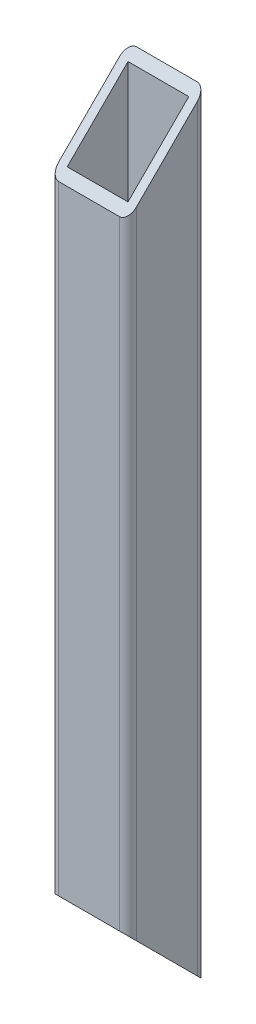
ISO-10303-21;
HEADER;
FILE_DESCRIPTION(('STEP AP214'),'2;1');
FILE_NAME('part.step','',(''),(''),'','','');
FILE_SCHEMA(('AUTOMOTIVE_DESIGN { 1 0 10303 214 1 1 1 1 }'));
ENDSEC;
DATA;
#1=APPLICATION_CONTEXT('core data for automotive mechanical design processes');
#2=APPLICATION_PROTOCOL_DEFINITION('international standard','automotive_design',2000,#1);
#3=PRODUCT_CONTEXT('',#1,'mechanical');
#4=PRODUCT('Part','Part','',(#3));
#5=PRODUCT_RELATED_PRODUCT_CATEGORY('part','',(#4));
#6=PRODUCT_DEFINITION_FORMATION('','',#4);
#7=PRODUCT_DEFINITION_CONTEXT('part definition',#1,'design');
#8=PRODUCT_DEFINITION('design','',#6,#7);
#9=PRODUCT_DEFINITION_SHAPE('','',#8);
#10=(LENGTH_UNIT() NAMED_UNIT(*) SI_UNIT(.MILLI.,.METRE.));
#11=(NAMED_UNIT(*) PLANE_ANGLE_UNIT() SI_UNIT($,.RADIAN.));
#12=(NAMED_UNIT(*) SI_UNIT($,.STERADIAN.) SOLID_ANGLE_UNIT());
#13=UNCERTAINTY_MEASURE_WITH_UNIT(LENGTH_MEASURE(1.E-05),#10,'distance_accuracy_value','');
#14=(GEOMETRIC_REPRESENTATION_CONTEXT(3) GLOBAL_UNCERTAINTY_ASSIGNED_CONTEXT((#13)) GLOBAL_UNIT_ASSIGNED_CONTEXT((#10,
#11,#12)) REPRESENTATION_CONTEXT('',''));
#15=CARTESIAN_POINT('',(0.,0.,0.));
#16=DIRECTION('',(0.,0.,1.));
#17=DIRECTION('',(1.,0.,0.));
#18=AXIS2_PLACEMENT_3D('',#15,#16,#17);
#19=CARTESIAN_POINT('',(22.8,254.788,2.8));
#20=DIRECTION('',(0.,-1.,0.));
#21=DIRECTION('',(0.,0.,-1.));
#22=AXIS2_PLACEMENT_3D('',#19,#20,#21);
#23=CYLINDRICAL_SURFACE('',#22,2.8);
#24=CARTESIAN_POINT('',(22.8,251.988,2.8));
#25=DIRECTION('',(0.,0.707106781186556,0.707106781186539));
#26=DIRECTION('',(0.,-0.707106781186539,0.707106781186556));
#27=AXIS2_PLACEMENT_3D('',#24,#25,#26);
#28=ELLIPSE('',#27,3.95979797464462,2.8);
#29=CARTESIAN_POINT('',(25.6,251.988,2.80000000000002));
#30=VERTEX_POINT('',#29);
#31=CARTESIAN_POINT('',(22.8,254.788,0.));
#32=VERTEX_POINT('',#31);
#33=EDGE_CURVE('E143',#30,#32,#28,.T.);
#34=ORIENTED_EDGE('',*,*,#33,.F.);
#35=DIRECTION('',(0.,-1.,0.));
#36=VECTOR('',#35,1.);
#37=CARTESIAN_POINT('',(25.6,254.788,2.80000000000002));
#38=LINE('',#37,#36);
#39=CARTESIAN_POINT('',(25.6,2.80000000000002,2.80000000000002));
#40=VERTEX_POINT('',#39);
#41=EDGE_CURVE('E144',#30,#40,#38,.T.);
#42=ORIENTED_EDGE('',*,*,#41,.T.);
#43=CARTESIAN_POINT('',(22.8,2.79999999999997,2.8));
#44=DIRECTION('',(0.,0.707106781186546,-0.707106781186549));
#45=DIRECTION('',(0.,-0.707106781186549,-0.707106781186546));
#46=AXIS2_PLACEMENT_3D('',#43,#44,#45);
#47=ELLIPSE('',#46,3.95979797464467,2.8);
#48=CARTESIAN_POINT('',(22.7999999999999,0.,0.));
#49=VERTEX_POINT('',#48);
#50=EDGE_CURVE('E205',#40,#49,#47,.T.);
#51=ORIENTED_EDGE('',*,*,#50,.T.);
#52=DIRECTION('',(0.,-1.,0.));
#53=VECTOR('',#52,1.);
#54=CARTESIAN_POINT('',(22.8,254.788,0.));
#55=LINE('',#54,#53);
#56=EDGE_CURVE('E131',#32,#49,#55,.T.);
#57=ORIENTED_EDGE('',*,*,#56,.F.);
#58=EDGE_LOOP('',(#34,#42,#51,#57));
#59=FACE_BOUND('',#58,.T.);
#60=ADVANCED_FACE('F32',(#59),#23,.T.);
#61=CARTESIAN_POINT('',(2.8,254.788,2.8));
#62=DIRECTION('',(0.,-1.,0.));
#63=DIRECTION('',(0.,0.,-1.));
#64=AXIS2_PLACEMENT_3D('',#61,#62,#63);
#65=CYLINDRICAL_SURFACE('',#64,2.8);
#66=CARTESIAN_POINT('',(2.8,251.988,2.8));
#67=DIRECTION('',(0.,0.707106781186556,0.707106781186539));
#68=DIRECTION('',(0.,-0.707106781186539,0.707106781186556));
#69=AXIS2_PLACEMENT_3D('',#66,#67,#68);
#70=ELLIPSE('',#69,3.95979797464462,2.8);
#71=CARTESIAN_POINT('',(2.80000000000002,254.788,0.));
#72=VERTEX_POINT('',#71);
#73=CARTESIAN_POINT('',(0.,251.988,2.80000000000002));
#74=VERTEX_POINT('',#73);
#75=EDGE_CURVE('E135',#72,#74,#70,.T.);
#76=ORIENTED_EDGE('',*,*,#75,.F.);
#77=DIRECTION('',(0.,-1.,0.));
#78=VECTOR('',#77,1.);
#79=CARTESIAN_POINT('',(2.80000000000002,254.788,0.));
#80=LINE('',#79,#78);
#81=CARTESIAN_POINT('',(2.80000000000002,0.,0.));
#82=VERTEX_POINT('',#81);
#83=EDGE_CURVE('E121',#72,#82,#80,.T.);
#84=ORIENTED_EDGE('',*,*,#83,.T.);
#85=CARTESIAN_POINT('',(2.8,2.80000000000002,2.8));
#86=DIRECTION('',(0.,0.707106781186546,-0.707106781186549));
#87=DIRECTION('',(0.,-0.707106781186549,-0.707106781186546));
#88=AXIS2_PLACEMENT_3D('',#85,#86,#87);
#89=ELLIPSE('',#88,3.95979797464467,2.8);
#90=CARTESIAN_POINT('',(0.,2.80000000000005,2.80000000000002));
#91=VERTEX_POINT('',#90);
#92=EDGE_CURVE('E203',#82,#91,#89,.T.);
#93=ORIENTED_EDGE('',*,*,#92,.T.);
#94=DIRECTION('',(0.,-1.,0.));
#95=VECTOR('',#94,1.);
#96=CARTESIAN_POINT('',(0.,254.788,2.80000000000002));
#97=LINE('',#96,#95);
#98=EDGE_CURVE('E132',#74,#91,#97,.T.);
#99=ORIENTED_EDGE('',*,*,#98,.F.);
#100=EDGE_LOOP('',(#76,#84,#93,#99));
#101=FACE_BOUND('',#100,.T.);
#102=ADVANCED_FACE('F136',(#101),#65,.T.);
#103=CARTESIAN_POINT('',(0.,254.788,2.80000000000002));
#104=DIRECTION('',(1.,0.,0.));
#105=DIRECTION('',(0.,0.,-1.));
#106=AXIS2_PLACEMENT_3D('',#103,#104,#105);
#107=PLANE('',#106);
#108=DIRECTION('',(0.,-0.707106781186539,0.707106781186556));
#109=VECTOR('',#108,1.);
#110=CARTESIAN_POINT('',(0.,253.388,1.40000000000004));
#111=LINE('',#110,#109);
#112=CARTESIAN_POINT('',(0.,231.988000000001,22.8));
#113=VERTEX_POINT('',#112);
#114=EDGE_CURVE('E46',#74,#113,#111,.T.);
#115=ORIENTED_EDGE('',*,*,#114,.F.);
#116=ORIENTED_EDGE('',*,*,#98,.T.);
#117=DIRECTION('',(0.,0.707106781186549,0.707106781186546));
#118=VECTOR('',#117,1.);
#119=CARTESIAN_POINT('',(0.,128.794,128.794));
#120=LINE('',#119,#118);
#121=CARTESIAN_POINT('',(0.,22.8,22.8));
#122=VERTEX_POINT('',#121);
#123=EDGE_CURVE('E200',#91,#122,#120,.T.);
#124=ORIENTED_EDGE('',*,*,#123,.T.);
#125=DIRECTION('',(0.,-1.,0.));
#126=VECTOR('',#125,1.);
#127=CARTESIAN_POINT('',(0.,254.788,22.8));
#128=LINE('',#127,#126);
#129=EDGE_CURVE('E159',#113,#122,#128,.T.);
#130=ORIENTED_EDGE('',*,*,#129,.F.);
#131=EDGE_LOOP('',(#115,#116,#124,#130));
#132=FACE_BOUND('',#131,.T.);
#133=ADVANCED_FACE('F242',(#132),#107,.F.);
#134=CARTESIAN_POINT('',(2.8,254.788,22.8));
#135=DIRECTION('',(0.,-1.,0.));
#136=DIRECTION('',(0.,0.,-1.));
#137=AXIS2_PLACEMENT_3D('',#134,#135,#136);
#138=CYLINDRICAL_SURFACE('',#137,2.8);
#139=CARTESIAN_POINT('',(2.8,231.988000000001,22.8));
#140=DIRECTION('',(0.,0.707106781186556,0.707106781186539));
#141=DIRECTION('',(0.,-0.707106781186539,0.707106781186556));
#142=AXIS2_PLACEMENT_3D('',#139,#140,#141);
#143=ELLIPSE('',#142,3.95979797464462,2.8);
#144=CARTESIAN_POINT('',(2.80000000000002,229.188000000001,25.6));
#145=VERTEX_POINT('',#144);
#146=EDGE_CURVE('E54',#113,#145,#143,.T.);
#147=ORIENTED_EDGE('',*,*,#146,.F.);
#148=ORIENTED_EDGE('',*,*,#129,.T.);
#149=CARTESIAN_POINT('',(2.8,22.8000000000001,22.8));
#150=DIRECTION('',(0.,0.707106781186546,-0.707106781186549));
#151=DIRECTION('',(0.,-0.707106781186549,-0.707106781186546));
#152=AXIS2_PLACEMENT_3D('',#149,#150,#151);
#153=ELLIPSE('',#152,3.95979797464467,2.8);
#154=CARTESIAN_POINT('',(2.80000000000002,25.6000000000001,25.6));
#155=VERTEX_POINT('',#154);
#156=EDGE_CURVE('E197',#122,#155,#153,.T.);
#157=ORIENTED_EDGE('',*,*,#156,.T.);
#158=DIRECTION('',(0.,-1.,0.));
#159=VECTOR('',#158,1.);
#160=CARTESIAN_POINT('',(2.80000000000002,254.788,25.6));
#161=LINE('',#160,#159);
#162=EDGE_CURVE('E157',#145,#155,#161,.T.);
#163=ORIENTED_EDGE('',*,*,#162,.F.);
#164=EDGE_LOOP('',(#147,#148,#157,#163));
#165=FACE_BOUND('',#164,.T.);
#166=ADVANCED_FACE('F237',(#165),#138,.T.);
#167=CARTESIAN_POINT('',(2.80000000000002,254.788,25.6));
#168=DIRECTION('',(0.,0.,-1.));
#169=DIRECTION('',(-1.,0.,0.));
#170=AXIS2_PLACEMENT_3D('',#167,#168,#169);
#171=PLANE('',#170);
#172=DIRECTION('',(1.,0.,0.));
#173=VECTOR('',#172,1.);
#174=CARTESIAN_POINT('',(-350.534154451226,229.188000000001,25.5999999999999));
#175=LINE('',#174,#173);
#176=CARTESIAN_POINT('',(22.8,229.188000000001,25.6));
#177=VERTEX_POINT('',#176);
#178=EDGE_CURVE('E218',#145,#177,#175,.T.);
#179=ORIENTED_EDGE('',*,*,#178,.F.);
#180=ORIENTED_EDGE('',*,*,#162,.T.);
#181=DIRECTION('',(1.,0.,0.));
#182=VECTOR('',#181,1.);
#183=CARTESIAN_POINT('',(2.79999999999998,25.6000000000001,25.6));
#184=LINE('',#183,#182);
#185=CARTESIAN_POINT('',(22.8,25.6000000000001,25.6));
#186=VERTEX_POINT('',#185);
#187=EDGE_CURVE('E194',#155,#186,#184,.T.);
#188=ORIENTED_EDGE('',*,*,#187,.T.);
#189=DIRECTION('',(0.,-1.,0.));
#190=VECTOR('',#189,1.);
#191=CARTESIAN_POINT('',(22.8,254.788,25.6));
#192=LINE('',#191,#190);
#193=EDGE_CURVE('E155',#177,#186,#192,.T.);
#194=ORIENTED_EDGE('',*,*,#193,.F.);
#195=EDGE_LOOP('',(#179,#180,#188,#194));
#196=FACE_BOUND('',#195,.T.);
#197=ADVANCED_FACE('F235',(#196),#171,.F.);
#198=CARTESIAN_POINT('',(22.8,254.788,22.8));
#199=DIRECTION('',(0.,-1.,0.));
#200=DIRECTION('',(0.,0.,-1.));
#201=AXIS2_PLACEMENT_3D('',#198,#199,#200);
#202=CYLINDRICAL_SURFACE('',#201,2.8);
#203=CARTESIAN_POINT('',(22.8,231.988000000001,22.8));
#204=DIRECTION('',(0.,0.707106781186556,0.707106781186539));
#205=DIRECTION('',(0.,-0.707106781186539,0.707106781186556));
#206=AXIS2_PLACEMENT_3D('',#203,#204,#205);
#207=ELLIPSE('',#206,3.95979797464462,2.8);
#208=CARTESIAN_POINT('',(25.6,231.988000000001,22.8));
#209=VERTEX_POINT('',#208);
#210=EDGE_CURVE('E223',#177,#209,#207,.T.);
#211=ORIENTED_EDGE('',*,*,#210,.F.);
#212=ORIENTED_EDGE('',*,*,#193,.T.);
#213=CARTESIAN_POINT('',(22.8,22.8,22.8));
#214=DIRECTION('',(0.,0.707106781186546,-0.707106781186549));
#215=DIRECTION('',(0.,-0.707106781186549,-0.707106781186546));
#216=AXIS2_PLACEMENT_3D('',#213,#214,#215);
#217=ELLIPSE('',#216,3.95979797464467,2.8);
#218=CARTESIAN_POINT('',(25.6,22.8000000000001,22.8));
#219=VERTEX_POINT('',#218);
#220=EDGE_CURVE('E187',#186,#219,#217,.T.);
#221=ORIENTED_EDGE('',*,*,#220,.T.);
#222=DIRECTION('',(0.,-1.,0.));
#223=VECTOR('',#222,1.);
#224=CARTESIAN_POINT('',(25.6,254.788,22.8));
#225=LINE('',#224,#223);
#226=EDGE_CURVE('E146',#209,#219,#225,.T.);
#227=ORIENTED_EDGE('',*,*,#226,.F.);
#228=EDGE_LOOP('',(#211,#212,#221,#227));
#229=FACE_BOUND('',#228,.T.);
#230=ADVANCED_FACE('F261',(#229),#202,.T.);
#231=CARTESIAN_POINT('',(25.6,254.788,2.80000000000002));
#232=DIRECTION('',(-1.,0.,0.));
#233=DIRECTION('',(0.,0.,1.));
#234=AXIS2_PLACEMENT_3D('',#231,#232,#233);
#235=PLANE('',#234);
#236=DIRECTION('',(0.,0.707106781186539,-0.707106781186556));
#237=VECTOR('',#236,1.);
#238=CARTESIAN_POINT('',(25.6,253.388,1.40000000000005));
#239=LINE('',#238,#237);
#240=EDGE_CURVE('E221',#209,#30,#239,.T.);
#241=ORIENTED_EDGE('',*,*,#240,.F.);
#242=ORIENTED_EDGE('',*,*,#226,.T.);
#243=DIRECTION('',(0.,-0.707106781186549,-0.707106781186546));
#244=VECTOR('',#243,1.);
#245=CARTESIAN_POINT('',(25.6,128.794,128.794));
#246=LINE('',#245,#244);
#247=EDGE_CURVE('E183',#219,#40,#246,.T.);
#248=ORIENTED_EDGE('',*,*,#247,.T.);
#249=ORIENTED_EDGE('',*,*,#41,.F.);
#250=EDGE_LOOP('',(#241,#242,#248,#249));
#251=FACE_BOUND('',#250,.T.);
#252=ADVANCED_FACE('F257',(#251),#235,.F.);
#253=CARTESIAN_POINT('',(22.8,1040.5,2.8));
#254=DIRECTION('',(1.,0.,0.));
#255=DIRECTION('',(0.,0.,-1.));
#256=AXIS2_PLACEMENT_3D('',#253,#254,#255);
#257=PLANE('',#256);
#258=DIRECTION('',(0.,-0.707106781186539,0.707106781186556));
#259=VECTOR('',#258,1.);
#260=CARTESIAN_POINT('',(22.8000000000001,646.24399999999,-391.456));
#261=LINE('',#260,#259);
#262=CARTESIAN_POINT('',(22.8,251.988,2.8));
#263=VERTEX_POINT('',#262);
#264=CARTESIAN_POINT('',(22.8,231.988000000001,22.8));
#265=VERTEX_POINT('',#264);
#266=EDGE_CURVE('E220',#263,#265,#261,.T.);
#267=ORIENTED_EDGE('',*,*,#266,.F.);
#268=DIRECTION('',(0.,-1.,0.));
#269=VECTOR('',#268,1.);
#270=CARTESIAN_POINT('',(22.8,1040.5,2.8));
#271=LINE('',#270,#269);
#272=CARTESIAN_POINT('',(22.8,2.80000000000014,2.8));
#273=VERTEX_POINT('',#272);
#274=EDGE_CURVE('E148',#263,#273,#271,.T.);
#275=ORIENTED_EDGE('',*,*,#274,.T.);
#276=DIRECTION('',(0.,0.707106781186549,0.707106781186546));
#277=VECTOR('',#276,1.);
#278=CARTESIAN_POINT('',(22.7999999999998,521.650000000002,521.65));
#279=LINE('',#278,#277);
#280=CARTESIAN_POINT('',(22.8,22.8000000000002,22.8));
#281=VERTEX_POINT('',#280);
#282=EDGE_CURVE('E176',#273,#281,#279,.T.);
#283=ORIENTED_EDGE('',*,*,#282,.T.);
#284=DIRECTION('',(0.,-1.,0.));
#285=VECTOR('',#284,1.);
#286=CARTESIAN_POINT('',(22.8,1040.5,22.8));
#287=LINE('',#286,#285);
#288=EDGE_CURVE('E151',#265,#281,#287,.T.);
#289=ORIENTED_EDGE('',*,*,#288,.F.);
#290=EDGE_LOOP('',(#267,#275,#283,#289));
#291=FACE_BOUND('',#290,.T.);
#292=ADVANCED_FACE('F180',(#291),#257,.F.);
#293=CARTESIAN_POINT('',(2.8,1040.5,2.8));
#294=DIRECTION('',(0.,0.,-1.));
#295=DIRECTION('',(-1.,0.,0.));
#296=AXIS2_PLACEMENT_3D('',#293,#294,#295);
#297=PLANE('',#296);
#298=DIRECTION('',(1.,0.,0.));
#299=VECTOR('',#298,1.);
#300=CARTESIAN_POINT('',(2.80000000000001,251.988,2.8));
#301=LINE('',#300,#299);
#302=CARTESIAN_POINT('',(2.8,251.988,2.80000000000001));
#303=VERTEX_POINT('',#302);
#304=EDGE_CURVE('E217',#303,#263,#301,.T.);
#305=ORIENTED_EDGE('',*,*,#304,.F.);
#306=DIRECTION('',(0.,-1.,0.));
#307=VECTOR('',#306,1.);
#308=CARTESIAN_POINT('',(2.8,1040.5,2.8));
#309=LINE('',#308,#307);
#310=CARTESIAN_POINT('',(2.8,2.80000000000014,2.79999999999991));
#311=VERTEX_POINT('',#310);
#312=EDGE_CURVE('E209',#303,#311,#309,.T.);
#313=ORIENTED_EDGE('',*,*,#312,.T.);
#314=DIRECTION('',(1.,0.,0.));
#315=VECTOR('',#314,1.);
#316=CARTESIAN_POINT('',(2.79999999999999,2.80000000000014,2.8));
#317=LINE('',#316,#315);
#318=EDGE_CURVE('E184',#311,#273,#317,.T.);
#319=ORIENTED_EDGE('',*,*,#318,.T.);
#320=ORIENTED_EDGE('',*,*,#274,.F.);
#321=EDGE_LOOP('',(#305,#313,#319,#320));
#322=FACE_BOUND('',#321,.T.);
#323=ADVANCED_FACE('F273',(#322),#297,.F.);
#324=CARTESIAN_POINT('',(2.8,1040.5,2.8));
#325=DIRECTION('',(-1.,0.,0.));
#326=DIRECTION('',(0.,0.,1.));
#327=AXIS2_PLACEMENT_3D('',#324,#325,#326);
#328=PLANE('',#327);
#329=DIRECTION('',(0.,0.707106781186539,-0.707106781186556));
#330=VECTOR('',#329,1.);
#331=CARTESIAN_POINT('',(2.80000000000013,646.24399999999,-391.456));
#332=LINE('',#331,#330);
#333=CARTESIAN_POINT('',(2.8,231.988000000001,22.8));
#334=VERTEX_POINT('',#333);
#335=EDGE_CURVE('E214',#334,#303,#332,.T.);
#336=ORIENTED_EDGE('',*,*,#335,.F.);
#337=DIRECTION('',(0.,-1.,0.));
#338=VECTOR('',#337,1.);
#339=CARTESIAN_POINT('',(2.8,1040.5,22.8));
#340=LINE('',#339,#338);
#341=CARTESIAN_POINT('',(2.8,22.8000000000002,22.8));
#342=VERTEX_POINT('',#341);
#343=EDGE_CURVE('E166',#334,#342,#340,.T.);
#344=ORIENTED_EDGE('',*,*,#343,.T.);
#345=DIRECTION('',(0.,-0.707106781186549,-0.707106781186546));
#346=VECTOR('',#345,1.);
#347=CARTESIAN_POINT('',(2.79999999999983,521.650000000002,521.65));
#348=LINE('',#347,#346);
#349=EDGE_CURVE('E138',#342,#311,#348,.T.);
#350=ORIENTED_EDGE('',*,*,#349,.T.);
#351=ORIENTED_EDGE('',*,*,#312,.F.);
#352=EDGE_LOOP('',(#336,#344,#350,#351));
#353=FACE_BOUND('',#352,.T.);
#354=ADVANCED_FACE('F211',(#353),#328,.F.);
#355=CARTESIAN_POINT('',(2.8,1040.5,22.8));
#356=DIRECTION('',(0.,0.,1.));
#357=DIRECTION('',(1.,0.,0.));
#358=AXIS2_PLACEMENT_3D('',#355,#356,#357);
#359=PLANE('',#358);
#360=DIRECTION('',(-1.,0.,0.));
#361=VECTOR('',#360,1.);
#362=CARTESIAN_POINT('',(2.79999999999999,231.988000000001,22.8));
#363=LINE('',#362,#361);
#364=EDGE_CURVE('E11',#265,#334,#363,.T.);
#365=ORIENTED_EDGE('',*,*,#364,.F.);
#366=ORIENTED_EDGE('',*,*,#288,.T.);
#367=DIRECTION('',(-1.,0.,0.));
#368=VECTOR('',#367,1.);
#369=CARTESIAN_POINT('',(2.80000000000001,22.8000000000002,22.8));
#370=LINE('',#369,#368);
#371=EDGE_CURVE('E39',#281,#342,#370,.T.);
#372=ORIENTED_EDGE('',*,*,#371,.T.);
#373=ORIENTED_EDGE('',*,*,#343,.F.);
#374=EDGE_LOOP('',(#365,#366,#372,#373));
#375=FACE_BOUND('',#374,.T.);
#376=ADVANCED_FACE('F165',(#375),#359,.F.);
#377=CARTESIAN_POINT('',(2.80000000000002,254.788,0.));
#378=DIRECTION('',(0.,0.,1.));
#379=DIRECTION('',(1.,0.,0.));
#380=AXIS2_PLACEMENT_3D('',#377,#378,#379);
#381=PLANE('',#380);
#382=DIRECTION('',(-1.,0.,0.));
#383=VECTOR('',#382,1.);
#384=CARTESIAN_POINT('',(2.80000000000002,0.,0.));
#385=LINE('',#384,#383);
#386=EDGE_CURVE('E128',#49,#82,#385,.T.);
#387=ORIENTED_EDGE('',*,*,#386,.T.);
#388=ORIENTED_EDGE('',*,*,#83,.F.);
#389=DIRECTION('',(-1.,0.,0.));
#390=VECTOR('',#389,1.);
#391=CARTESIAN_POINT('',(2.80000000000002,254.788,0.));
#392=LINE('',#391,#390);
#393=EDGE_CURVE('E126',#32,#72,#392,.T.);
#394=ORIENTED_EDGE('',*,*,#393,.F.);
#395=ORIENTED_EDGE('',*,*,#56,.T.);
#396=EDGE_LOOP('',(#387,#388,#394,#395));
#397=FACE_BOUND('',#396,.T.);
#398=ADVANCED_FACE('F123',(#397),#381,.F.);
#399=CARTESIAN_POINT('',(-347.034154451226,0.,0.));
#400=DIRECTION('',(0.,0.707106781186546,-0.707106781186549));
#401=DIRECTION('',(0.,0.707106781186549,0.707106781186546));
#402=AXIS2_PLACEMENT_3D('',#399,#400,#401);
#403=PLANE('',#402);
#404=ORIENTED_EDGE('',*,*,#282,.F.);
#405=ORIENTED_EDGE('',*,*,#318,.F.);
#406=ORIENTED_EDGE('',*,*,#349,.F.);
#407=ORIENTED_EDGE('',*,*,#371,.F.);
#408=EDGE_LOOP('',(#404,#405,#406,#407));
#409=FACE_BOUND('',#408,.T.);
#410=ORIENTED_EDGE('',*,*,#50,.F.);
#411=ORIENTED_EDGE('',*,*,#247,.F.);
#412=ORIENTED_EDGE('',*,*,#220,.F.);
#413=ORIENTED_EDGE('',*,*,#187,.F.);
#414=ORIENTED_EDGE('',*,*,#156,.F.);
#415=ORIENTED_EDGE('',*,*,#123,.F.);
#416=ORIENTED_EDGE('',*,*,#92,.F.);
#417=ORIENTED_EDGE('',*,*,#386,.F.);
#418=EDGE_LOOP('',(#410,#411,#412,#413,#414,#415,#416,#417));
#419=FACE_BOUND('',#418,.T.);
#420=ADVANCED_FACE('F173',(#409,#419),#403,.F.);
#421=CARTESIAN_POINT('',(-350.534154451226,254.788,0.));
#422=DIRECTION('',(0.,0.707106781186556,0.707106781186539));
#423=DIRECTION('',(0.,-0.707106781186539,0.707106781186556));
#424=AXIS2_PLACEMENT_3D('',#421,#422,#423);
#425=PLANE('',#424);
#426=ORIENTED_EDGE('',*,*,#304,.T.);
#427=ORIENTED_EDGE('',*,*,#266,.T.);
#428=ORIENTED_EDGE('',*,*,#364,.T.);
#429=ORIENTED_EDGE('',*,*,#335,.T.);
#430=EDGE_LOOP('',(#426,#427,#428,#429));
#431=FACE_BOUND('',#430,.T.);
#432=ORIENTED_EDGE('',*,*,#393,.T.);
#433=ORIENTED_EDGE('',*,*,#75,.T.);
#434=ORIENTED_EDGE('',*,*,#114,.T.);
#435=ORIENTED_EDGE('',*,*,#146,.T.);
#436=ORIENTED_EDGE('',*,*,#178,.T.);
#437=ORIENTED_EDGE('',*,*,#210,.T.);
#438=ORIENTED_EDGE('',*,*,#240,.T.);
#439=ORIENTED_EDGE('',*,*,#33,.T.);
#440=EDGE_LOOP('',(#432,#433,#434,#435,#436,#437,#438,#439));
#441=FACE_BOUND('',#440,.T.);
#442=ADVANCED_FACE('F141',(#431,#441),#425,.T.);
#443=CLOSED_SHELL('',(#60,#102,#133,#166,#197,#230,#252,#292,#323,#354,#376,#398,#420,#442));
#444=MANIFOLD_SOLID_BREP('B2',#443);
#445=ADVANCED_BREP_SHAPE_REPRESENTATION('',(#18,#444),#14);
#446=SHAPE_DEFINITION_REPRESENTATION(#9,#445);
ENDSEC;
END-ISO-10303-21;
